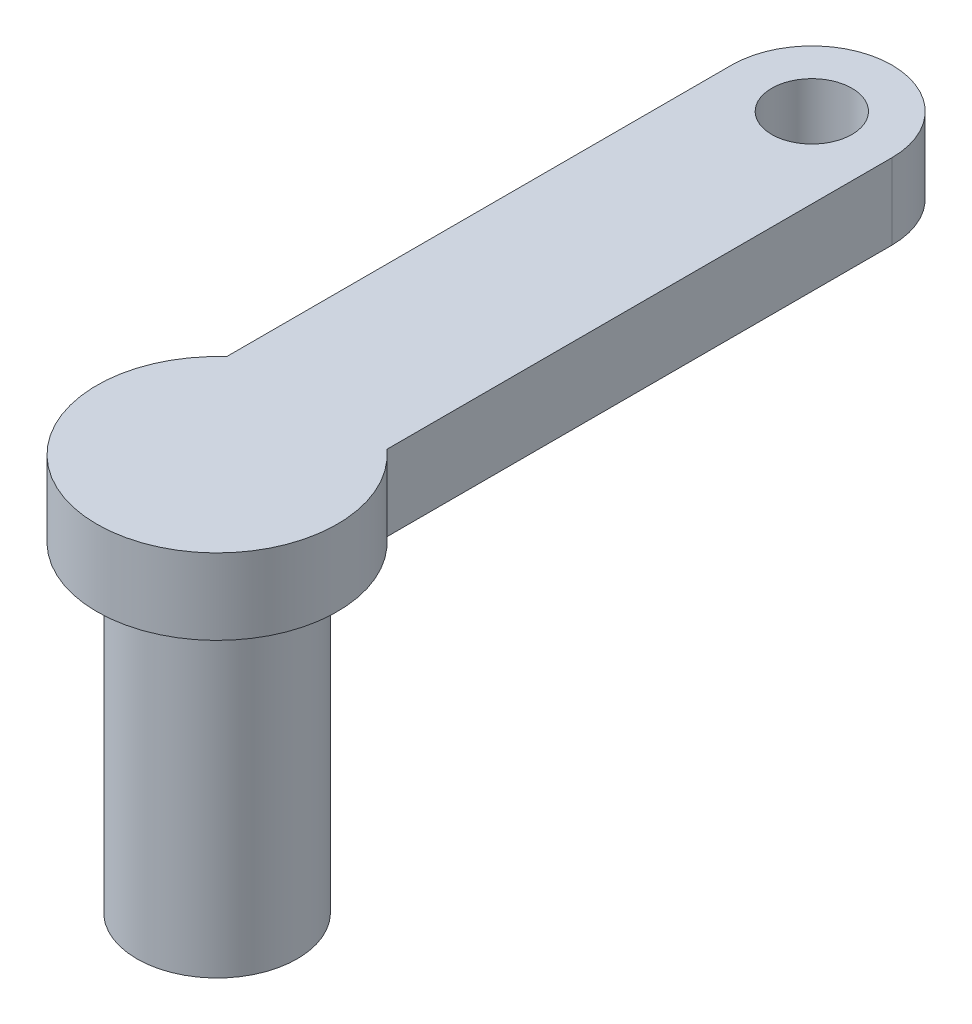
ISO-10303-21;
HEADER;
FILE_DESCRIPTION(('STEP AP214'),'2;1');
FILE_NAME('part.step','',(''),(''),'','','');
FILE_SCHEMA(('AUTOMOTIVE_DESIGN { 1 0 10303 214 1 1 1 1 }'));
ENDSEC;
DATA;
#1=APPLICATION_CONTEXT('core data for automotive mechanical design processes');
#2=APPLICATION_PROTOCOL_DEFINITION('international standard','automotive_design',2000,#1);
#3=PRODUCT_CONTEXT('',#1,'mechanical');
#4=PRODUCT('Part','Part','',(#3));
#5=PRODUCT_RELATED_PRODUCT_CATEGORY('part','',(#4));
#6=PRODUCT_DEFINITION_FORMATION('','',#4);
#7=PRODUCT_DEFINITION_CONTEXT('part definition',#1,'design');
#8=PRODUCT_DEFINITION('design','',#6,#7);
#9=PRODUCT_DEFINITION_SHAPE('','',#8);
#10=(LENGTH_UNIT() NAMED_UNIT(*) SI_UNIT(.MILLI.,.METRE.));
#11=(NAMED_UNIT(*) PLANE_ANGLE_UNIT() SI_UNIT($,.RADIAN.));
#12=(NAMED_UNIT(*) SI_UNIT($,.STERADIAN.) SOLID_ANGLE_UNIT());
#13=UNCERTAINTY_MEASURE_WITH_UNIT(LENGTH_MEASURE(1.E-05),#10,'distance_accuracy_value','');
#14=(GEOMETRIC_REPRESENTATION_CONTEXT(3) GLOBAL_UNCERTAINTY_ASSIGNED_CONTEXT((#13)) GLOBAL_UNIT_ASSIGNED_CONTEXT((#10,
#11,#12)) REPRESENTATION_CONTEXT('',''));
#15=CARTESIAN_POINT('',(0.,0.,0.));
#16=DIRECTION('',(0.,0.,1.));
#17=DIRECTION('',(1.,0.,0.));
#18=AXIS2_PLACEMENT_3D('',#15,#16,#17);
#19=CARTESIAN_POINT('',(0.,37.5,0.));
#20=DIRECTION('',(0.,1.,0.));
#21=DIRECTION('',(0.,0.,1.));
#22=AXIS2_PLACEMENT_3D('',#19,#20,#21);
#23=PLANE('',#22);
#24=CARTESIAN_POINT('',(0.,37.5,0.));
#25=DIRECTION('',(0.,1.,0.));
#26=DIRECTION('',(0.,0.,1.));
#27=AXIS2_PLACEMENT_3D('',#24,#25,#26);
#28=CIRCLE('',#27,59.53125);
#29=CARTESIAN_POINT('',(-39.6875,37.5,-44.3719739285115));
#30=VERTEX_POINT('',#29);
#31=CARTESIAN_POINT('',(39.6875,37.5,-44.3719739285115));
#32=VERTEX_POINT('',#31);
#33=EDGE_CURVE('E107',#30,#32,#28,.T.);
#34=ORIENTED_EDGE('',*,*,#33,.T.);
#35=DIRECTION('',(0.,0.,-1.));
#36=VECTOR('',#35,1.);
#37=CARTESIAN_POINT('',(39.6875,37.5,-44.3719739285115));
#38=LINE('',#37,#36);
#39=CARTESIAN_POINT('',(39.6875,37.5,-294.371973928511));
#40=VERTEX_POINT('',#39);
#41=EDGE_CURVE('E100',#32,#40,#38,.T.);
#42=ORIENTED_EDGE('',*,*,#41,.T.);
#43=CARTESIAN_POINT('',(0.,37.5,-294.371973928511));
#44=DIRECTION('',(0.,1.,0.));
#45=DIRECTION('',(0.,0.,1.));
#46=AXIS2_PLACEMENT_3D('',#43,#44,#45);
#47=CIRCLE('',#46,39.6875);
#48=CARTESIAN_POINT('',(-39.6875,37.5,-294.371973928511));
#49=VERTEX_POINT('',#48);
#50=EDGE_CURVE('E106',#40,#49,#47,.T.);
#51=ORIENTED_EDGE('',*,*,#50,.T.);
#52=DIRECTION('',(0.,0.,-1.));
#53=VECTOR('',#52,1.);
#54=CARTESIAN_POINT('',(-39.6875,37.5,-44.3719739285115));
#55=LINE('',#54,#53);
#56=EDGE_CURVE('E120',#30,#49,#55,.T.);
#57=ORIENTED_EDGE('',*,*,#56,.F.);
#58=EDGE_LOOP('',(#34,#42,#51,#57));
#59=FACE_BOUND('',#58,.T.);
#60=CARTESIAN_POINT('',(0.,37.5,-294.371973928511));
#61=DIRECTION('',(0.,1.,0.));
#62=DIRECTION('',(0.,0.,1.));
#63=AXIS2_PLACEMENT_3D('',#60,#61,#62);
#64=CIRCLE('',#63,19.84375);
#65=CARTESIAN_POINT('',(0.,37.5,-274.528223928511));
#66=VERTEX_POINT('',#65);
#67=EDGE_CURVE('E129',#66,#66,#64,.T.);
#68=ORIENTED_EDGE('',*,*,#67,.F.);
#69=EDGE_LOOP('',(#68));
#70=FACE_BOUND('',#69,.T.);
#71=ADVANCED_FACE('F54',(#59,#70),#23,.T.);
#72=CARTESIAN_POINT('',(0.,0.,0.));
#73=DIRECTION('',(0.,1.,0.));
#74=DIRECTION('',(0.,0.,1.));
#75=AXIS2_PLACEMENT_3D('',#72,#73,#74);
#76=PLANE('',#75);
#77=CARTESIAN_POINT('',(0.,0.,0.));
#78=DIRECTION('',(0.,-1.,0.));
#79=DIRECTION('',(0.,0.,-1.));
#80=AXIS2_PLACEMENT_3D('',#77,#78,#79);
#81=CIRCLE('',#80,39.6875);
#82=CARTESIAN_POINT('',(0.,0.,39.6875));
#83=VERTEX_POINT('',#82);
#84=EDGE_CURVE('E12',#83,#83,#81,.T.);
#85=ORIENTED_EDGE('',*,*,#84,.F.);
#86=EDGE_LOOP('',(#85));
#87=FACE_BOUND('',#86,.T.);
#88=CARTESIAN_POINT('',(0.,0.,0.));
#89=DIRECTION('',(0.,1.,0.));
#90=DIRECTION('',(0.,0.,1.));
#91=AXIS2_PLACEMENT_3D('',#88,#89,#90);
#92=CIRCLE('',#91,59.53125);
#93=CARTESIAN_POINT('',(-39.6875,0.,-44.3719739285115));
#94=VERTEX_POINT('',#93);
#95=CARTESIAN_POINT('',(39.6875,0.,-44.3719739285115));
#96=VERTEX_POINT('',#95);
#97=EDGE_CURVE('E126',#94,#96,#92,.T.);
#98=ORIENTED_EDGE('',*,*,#97,.F.);
#99=DIRECTION('',(0.,0.,-1.));
#100=VECTOR('',#99,1.);
#101=CARTESIAN_POINT('',(-39.6875,0.,-44.3719739285115));
#102=LINE('',#101,#100);
#103=CARTESIAN_POINT('',(-39.6875,0.,-294.371973928511));
#104=VERTEX_POINT('',#103);
#105=EDGE_CURVE('E135',#94,#104,#102,.T.);
#106=ORIENTED_EDGE('',*,*,#105,.T.);
#107=CARTESIAN_POINT('',(0.,0.,-294.371973928511));
#108=DIRECTION('',(0.,1.,0.));
#109=DIRECTION('',(0.,0.,1.));
#110=AXIS2_PLACEMENT_3D('',#107,#108,#109);
#111=CIRCLE('',#110,39.6875);
#112=CARTESIAN_POINT('',(39.6875,0.,-294.371973928511));
#113=VERTEX_POINT('',#112);
#114=EDGE_CURVE('E132',#113,#104,#111,.T.);
#115=ORIENTED_EDGE('',*,*,#114,.F.);
#116=DIRECTION('',(0.,0.,-1.));
#117=VECTOR('',#116,1.);
#118=CARTESIAN_POINT('',(39.6875,0.,-44.3719739285115));
#119=LINE('',#118,#117);
#120=EDGE_CURVE('E114',#96,#113,#119,.T.);
#121=ORIENTED_EDGE('',*,*,#120,.F.);
#122=EDGE_LOOP('',(#98,#106,#115,#121));
#123=FACE_BOUND('',#122,.T.);
#124=CARTESIAN_POINT('',(0.,0.,-294.371973928511));
#125=DIRECTION('',(0.,1.,0.));
#126=DIRECTION('',(0.,0.,1.));
#127=AXIS2_PLACEMENT_3D('',#124,#125,#126);
#128=CIRCLE('',#127,19.84375);
#129=CARTESIAN_POINT('',(0.,0.,-274.528223928511));
#130=VERTEX_POINT('',#129);
#131=EDGE_CURVE('E178',#130,#130,#128,.T.);
#132=ORIENTED_EDGE('',*,*,#131,.T.);
#133=EDGE_LOOP('',(#132));
#134=FACE_BOUND('',#133,.T.);
#135=ADVANCED_FACE('F144',(#87,#123,#134),#76,.F.);
#136=CARTESIAN_POINT('',(0.,37.5,0.));
#137=DIRECTION('',(0.,-1.,0.));
#138=DIRECTION('',(0.,0.,-1.));
#139=AXIS2_PLACEMENT_3D('',#136,#137,#138);
#140=CYLINDRICAL_SURFACE('',#139,59.53125);
#141=ORIENTED_EDGE('',*,*,#97,.T.);
#142=DIRECTION('',(0.,-1.,0.));
#143=VECTOR('',#142,1.);
#144=CARTESIAN_POINT('',(39.6875,37.5,-44.3719739285115));
#145=LINE('',#144,#143);
#146=EDGE_CURVE('E58',#32,#96,#145,.T.);
#147=ORIENTED_EDGE('',*,*,#146,.F.);
#148=ORIENTED_EDGE('',*,*,#33,.F.);
#149=DIRECTION('',(0.,-1.,0.));
#150=VECTOR('',#149,1.);
#151=CARTESIAN_POINT('',(-39.6875,37.5,-44.3719739285115));
#152=LINE('',#151,#150);
#153=EDGE_CURVE('E73',#30,#94,#152,.T.);
#154=ORIENTED_EDGE('',*,*,#153,.T.);
#155=EDGE_LOOP('',(#141,#147,#148,#154));
#156=FACE_BOUND('',#155,.T.);
#157=ADVANCED_FACE('F56',(#156),#140,.T.);
#158=CARTESIAN_POINT('',(39.6875,37.5,-44.3719739285115));
#159=DIRECTION('',(-1.,0.,0.));
#160=DIRECTION('',(0.,0.,1.));
#161=AXIS2_PLACEMENT_3D('',#158,#159,#160);
#162=PLANE('',#161);
#163=ORIENTED_EDGE('',*,*,#120,.T.);
#164=DIRECTION('',(0.,-1.,0.));
#165=VECTOR('',#164,1.);
#166=CARTESIAN_POINT('',(39.6875,37.5,-294.371973928511));
#167=LINE('',#166,#165);
#168=EDGE_CURVE('E112',#40,#113,#167,.T.);
#169=ORIENTED_EDGE('',*,*,#168,.F.);
#170=ORIENTED_EDGE('',*,*,#41,.F.);
#171=ORIENTED_EDGE('',*,*,#146,.T.);
#172=EDGE_LOOP('',(#163,#169,#170,#171));
#173=FACE_BOUND('',#172,.T.);
#174=ADVANCED_FACE('F113',(#173),#162,.F.);
#175=CARTESIAN_POINT('',(0.,37.5,-294.371973928511));
#176=DIRECTION('',(0.,-1.,0.));
#177=DIRECTION('',(0.,0.,-1.));
#178=AXIS2_PLACEMENT_3D('',#175,#176,#177);
#179=CYLINDRICAL_SURFACE('',#178,39.6875);
#180=ORIENTED_EDGE('',*,*,#114,.T.);
#181=DIRECTION('',(0.,-1.,0.));
#182=VECTOR('',#181,1.);
#183=CARTESIAN_POINT('',(-39.6875,37.5,-294.371973928511));
#184=LINE('',#183,#182);
#185=EDGE_CURVE('E88',#49,#104,#184,.T.);
#186=ORIENTED_EDGE('',*,*,#185,.F.);
#187=ORIENTED_EDGE('',*,*,#50,.F.);
#188=ORIENTED_EDGE('',*,*,#168,.T.);
#189=EDGE_LOOP('',(#180,#186,#187,#188));
#190=FACE_BOUND('',#189,.T.);
#191=ADVANCED_FACE('F118',(#190),#179,.T.);
#192=CARTESIAN_POINT('',(-39.6875,37.5,-44.3719739285115));
#193=DIRECTION('',(-1.,0.,0.));
#194=DIRECTION('',(0.,0.,1.));
#195=AXIS2_PLACEMENT_3D('',#192,#193,#194);
#196=PLANE('',#195);
#197=ORIENTED_EDGE('',*,*,#105,.F.);
#198=ORIENTED_EDGE('',*,*,#153,.F.);
#199=ORIENTED_EDGE('',*,*,#56,.T.);
#200=ORIENTED_EDGE('',*,*,#185,.T.);
#201=EDGE_LOOP('',(#197,#198,#199,#200));
#202=FACE_BOUND('',#201,.T.);
#203=ADVANCED_FACE('F146',(#202),#196,.T.);
#204=CARTESIAN_POINT('',(0.,37.5,-294.371973928511));
#205=DIRECTION('',(0.,-1.,0.));
#206=DIRECTION('',(0.,0.,-1.));
#207=AXIS2_PLACEMENT_3D('',#204,#205,#206);
#208=CYLINDRICAL_SURFACE('',#207,19.84375);
#209=ORIENTED_EDGE('',*,*,#67,.T.);
#210=EDGE_LOOP('',(#209));
#211=FACE_BOUND('',#210,.T.);
#212=ORIENTED_EDGE('',*,*,#131,.F.);
#213=EDGE_LOOP('',(#212));
#214=FACE_BOUND('',#213,.T.);
#215=ADVANCED_FACE('F148',(#211,#214),#208,.F.);
#216=CARTESIAN_POINT('',(0.,-158.75,0.));
#217=DIRECTION('',(0.,1.,0.));
#218=DIRECTION('',(0.,0.,1.));
#219=AXIS2_PLACEMENT_3D('',#216,#217,#218);
#220=CYLINDRICAL_SURFACE('',#219,39.6875);
#221=CARTESIAN_POINT('',(0.,-158.75,0.));
#222=DIRECTION('',(0.,-1.,0.));
#223=DIRECTION('',(0.,0.,-1.));
#224=AXIS2_PLACEMENT_3D('',#221,#222,#223);
#225=CIRCLE('',#224,39.6875);
#226=CARTESIAN_POINT('',(0.,-158.75,39.6875));
#227=VERTEX_POINT('',#226);
#228=EDGE_CURVE('E176',#227,#227,#225,.T.);
#229=CARTESIAN_POINT('',(0.,-158.75,39.6875));
#230=CARTESIAN_POINT('',(0.,-157.096354166667,39.6875));
#231=CARTESIAN_POINT('',(0.,-155.442708333333,39.6875));
#232=CARTESIAN_POINT('',(0.,-152.135416666667,39.6875));
#233=CARTESIAN_POINT('',(0.,-150.481770833333,39.6875));
#234=CARTESIAN_POINT('',(0.,-147.174479166667,39.6875));
#235=CARTESIAN_POINT('',(0.,-145.520833333333,39.6875));
#236=CARTESIAN_POINT('',(0.,-142.213541666667,39.6875));
#237=CARTESIAN_POINT('',(0.,-140.559895833333,39.6875));
#238=CARTESIAN_POINT('',(0.,-137.252604166667,39.6875));
#239=CARTESIAN_POINT('',(0.,-135.598958333333,39.6875));
#240=CARTESIAN_POINT('',(0.,-132.291666666667,39.6875));
#241=CARTESIAN_POINT('',(0.,-130.638020833333,39.6875));
#242=CARTESIAN_POINT('',(0.,-127.330729166667,39.6875));
#243=CARTESIAN_POINT('',(0.,-125.677083333333,39.6875));
#244=CARTESIAN_POINT('',(0.,-122.369791666667,39.6875));
#245=CARTESIAN_POINT('',(0.,-120.716145833333,39.6875));
#246=CARTESIAN_POINT('',(0.,-117.408854166667,39.6875));
#247=CARTESIAN_POINT('',(0.,-115.755208333333,39.6875));
#248=CARTESIAN_POINT('',(0.,-112.447916666667,39.6875));
#249=CARTESIAN_POINT('',(0.,-110.794270833333,39.6875));
#250=CARTESIAN_POINT('',(0.,-107.486979166667,39.6875));
#251=CARTESIAN_POINT('',(0.,-105.833333333333,39.6875));
#252=CARTESIAN_POINT('',(0.,-102.526041666667,39.6875));
#253=CARTESIAN_POINT('',(0.,-100.872395833333,39.6875));
#254=CARTESIAN_POINT('',(0.,-97.5651041666666,39.6875));
#255=CARTESIAN_POINT('',(0.,-95.9114583333333,39.6875));
#256=CARTESIAN_POINT('',(0.,-92.6041666666666,39.6875));
#257=CARTESIAN_POINT('',(0.,-90.9505208333333,39.6875));
#258=CARTESIAN_POINT('',(0.,-87.6432291666666,39.6875));
#259=CARTESIAN_POINT('',(0.,-85.9895833333333,39.6875));
#260=CARTESIAN_POINT('',(0.,-82.6822916666666,39.6875));
#261=CARTESIAN_POINT('',(0.,-81.0286458333333,39.6875));
#262=CARTESIAN_POINT('',(0.,-77.7213541666666,39.6875));
#263=CARTESIAN_POINT('',(0.,-76.0677083333333,39.6875));
#264=CARTESIAN_POINT('',(0.,-72.7604166666666,39.6875));
#265=CARTESIAN_POINT('',(0.,-71.1067708333333,39.6875));
#266=CARTESIAN_POINT('',(0.,-67.7994791666666,39.6875));
#267=CARTESIAN_POINT('',(0.,-66.1458333333333,39.6875));
#268=CARTESIAN_POINT('',(0.,-62.8385416666666,39.6875));
#269=CARTESIAN_POINT('',(0.,-61.1848958333333,39.6875));
#270=CARTESIAN_POINT('',(0.,-57.8776041666666,39.6875));
#271=CARTESIAN_POINT('',(0.,-56.2239583333333,39.6875));
#272=CARTESIAN_POINT('',(0.,-52.9166666666666,39.6875));
#273=CARTESIAN_POINT('',(0.,-51.2630208333333,39.6875));
#274=CARTESIAN_POINT('',(0.,-47.9557291666666,39.6875));
#275=CARTESIAN_POINT('',(0.,-46.3020833333333,39.6875));
#276=CARTESIAN_POINT('',(0.,-42.9947916666666,39.6875));
#277=CARTESIAN_POINT('',(0.,-41.3411458333333,39.6875));
#278=CARTESIAN_POINT('',(0.,-38.0338541666666,39.6875));
#279=CARTESIAN_POINT('',(0.,-36.3802083333333,39.6875));
#280=CARTESIAN_POINT('',(0.,-33.0729166666666,39.6875));
#281=CARTESIAN_POINT('',(0.,-31.4192708333333,39.6875));
#282=CARTESIAN_POINT('',(0.,-28.1119791666667,39.6875));
#283=CARTESIAN_POINT('',(0.,-26.4583333333333,39.6875));
#284=CARTESIAN_POINT('',(0.,-23.1510416666666,39.6875));
#285=CARTESIAN_POINT('',(0.,-21.4973958333333,39.6875));
#286=CARTESIAN_POINT('',(0.,-18.1901041666666,39.6875));
#287=CARTESIAN_POINT('',(0.,-16.5364583333333,39.6875));
#288=CARTESIAN_POINT('',(0.,-13.2291666666666,39.6875));
#289=CARTESIAN_POINT('',(0.,-11.5755208333333,39.6875));
#290=CARTESIAN_POINT('',(0.,-8.26822916666664,39.6875));
#291=CARTESIAN_POINT('',(0.,-6.61458333333331,39.6875));
#292=CARTESIAN_POINT('',(0.,-3.30729166666665,39.6875));
#293=CARTESIAN_POINT('',(0.,-1.65364583333331,39.6875));
#294=CARTESIAN_POINT('',(0.,0.,39.6875));
#295=B_SPLINE_CURVE_WITH_KNOTS('',3,(#229,#230,#231,#232,#233,#234,#235,#236,#237,#238,#239,
#240,#241,#242,#243,#244,#245,#246,#247,#248,#249,#250,#251,#252,#253,#254,#255,#256,#257,#258,
#259,#260,#261,#262,#263,#264,#265,#266,#267,#268,#269,#270,#271,#272,#273,#274,#275,#276,#277,
#278,#279,#280,#281,#282,#283,#284,#285,#286,#287,#288,#289,#290,#291,#292,#293,#294),
.UNSPECIFIED.,.F.,.F.,(4,2,2,2,2,2,2,2,2,2,2,2,2,2,2,2,2,2,2,2,2,2,2,2,2,2,2,2,2,2,2,2,4),(0.,
4.96093750000001,9.92187500000002,14.8828125,19.84375,24.8046875,29.765625,34.7265625,39.6875,
44.6484375,49.609375,54.5703125,59.53125,64.4921875,69.453125,74.4140625,79.375,84.3359375,
89.296875,94.2578125,99.21875,104.1796875,109.140625,114.1015625,119.0625,124.0234375,
128.984375,133.9453125,138.90625,143.8671875,148.828125,153.7890625,158.75),.UNSPECIFIED.);
#296=EDGE_CURVE('BSEAM154',#227,#83,#295,.T.);
#297=ORIENTED_EDGE('',*,*,#228,.F.);
#298=ORIENTED_EDGE('',*,*,#84,.T.);
#299=ORIENTED_EDGE('',*,*,#296,.T.);
#300=ORIENTED_EDGE('',*,*,#296,.F.);
#301=EDGE_LOOP('',(#297,#299,#298,#300));
#302=FACE_BOUND('',#301,.T.);
#303=ADVANCED_FACE('F154',(#302),#220,.T.);
#304=CARTESIAN_POINT('',(0.,-158.75,0.));
#305=DIRECTION('',(0.,-1.,0.));
#306=DIRECTION('',(0.,0.,-1.));
#307=AXIS2_PLACEMENT_3D('',#304,#305,#306);
#308=PLANE('',#307);
#309=ORIENTED_EDGE('',*,*,#228,.T.);
#310=EDGE_LOOP('',(#309));
#311=FACE_BOUND('',#310,.T.);
#312=ADVANCED_FACE('F168',(#311),#308,.T.);
#313=CLOSED_SHELL('',(#71,#135,#157,#174,#191,#203,#215,#303,#312));
#314=MANIFOLD_SOLID_BREP('B2',#313);
#315=ADVANCED_BREP_SHAPE_REPRESENTATION('',(#18,#314),#14);
#316=SHAPE_DEFINITION_REPRESENTATION(#9,#315);
ENDSEC;
END-ISO-10303-21;
